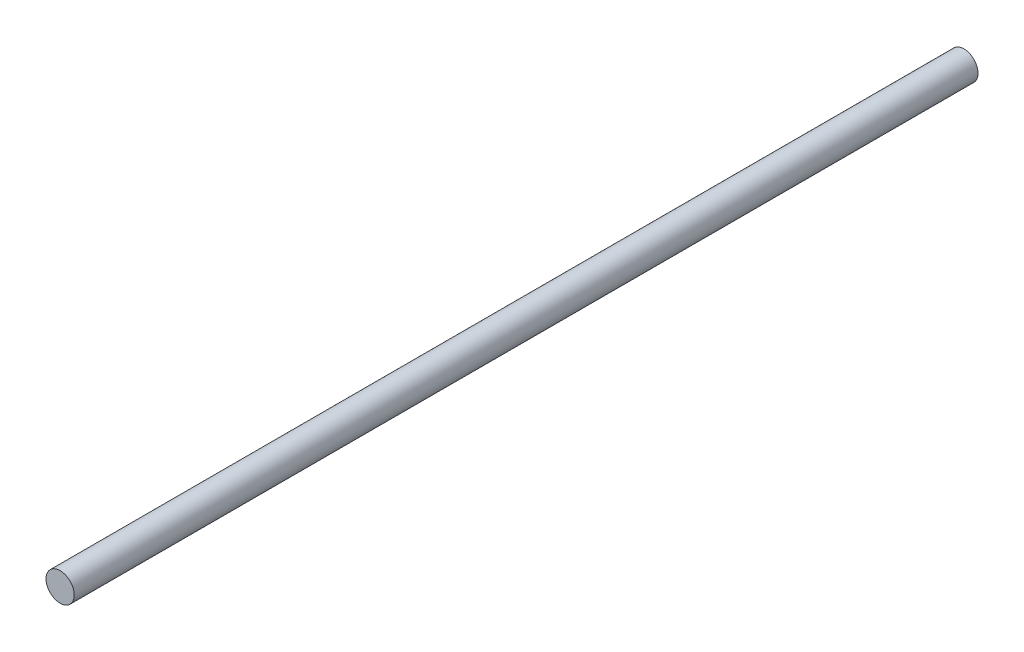
ISO-10303-21;
HEADER;
FILE_DESCRIPTION(('STEP AP214'),'2;1');
FILE_NAME('part.step','',(''),(''),'','','');
FILE_SCHEMA(('AUTOMOTIVE_DESIGN { 1 0 10303 214 1 1 1 1 }'));
ENDSEC;
DATA;
#1=APPLICATION_CONTEXT('core data for automotive mechanical design processes');
#2=APPLICATION_PROTOCOL_DEFINITION('international standard','automotive_design',2000,#1);
#3=PRODUCT_CONTEXT('',#1,'mechanical');
#4=PRODUCT('Part','Part','',(#3));
#5=PRODUCT_RELATED_PRODUCT_CATEGORY('part','',(#4));
#6=PRODUCT_DEFINITION_FORMATION('','',#4);
#7=PRODUCT_DEFINITION_CONTEXT('part definition',#1,'design');
#8=PRODUCT_DEFINITION('design','',#6,#7);
#9=PRODUCT_DEFINITION_SHAPE('','',#8);
#10=(LENGTH_UNIT() NAMED_UNIT(*) SI_UNIT(.MILLI.,.METRE.));
#11=(NAMED_UNIT(*) PLANE_ANGLE_UNIT() SI_UNIT($,.RADIAN.));
#12=(NAMED_UNIT(*) SI_UNIT($,.STERADIAN.) SOLID_ANGLE_UNIT());
#13=UNCERTAINTY_MEASURE_WITH_UNIT(LENGTH_MEASURE(1.E-05),#10,'distance_accuracy_value','');
#14=(GEOMETRIC_REPRESENTATION_CONTEXT(3) GLOBAL_UNCERTAINTY_ASSIGNED_CONTEXT((#13)) GLOBAL_UNIT_ASSIGNED_CONTEXT((#10,
#11,#12)) REPRESENTATION_CONTEXT('',''));
#15=CARTESIAN_POINT('',(0.,0.,0.));
#16=DIRECTION('',(0.,0.,1.));
#17=DIRECTION('',(1.,0.,0.));
#18=AXIS2_PLACEMENT_3D('',#15,#16,#17);
#19=CARTESIAN_POINT('',(0.,0.,160.));
#20=DIRECTION('',(0.,0.,1.));
#21=DIRECTION('',(1.,0.,0.));
#22=AXIS2_PLACEMENT_3D('',#19,#20,#21);
#23=PLANE('',#22);
#24=CARTESIAN_POINT('',(0.,0.,160.));
#25=DIRECTION('',(0.,0.,-1.));
#26=DIRECTION('',(-1.,0.,0.));
#27=AXIS2_PLACEMENT_3D('',#24,#25,#26);
#28=CIRCLE('',#27,2.5);
#29=CARTESIAN_POINT('',(-2.5,0.,160.));
#30=VERTEX_POINT('',#29);
#31=EDGE_CURVE('E18',#30,#30,#28,.T.);
#32=ORIENTED_EDGE('',*,*,#31,.F.);
#33=EDGE_LOOP('',(#32));
#34=FACE_BOUND('',#33,.T.);
#35=ADVANCED_FACE('F15',(#34),#23,.T.);
#36=CARTESIAN_POINT('',(0.,0.,0.));
#37=DIRECTION('',(0.,0.,1.));
#38=DIRECTION('',(1.,0.,0.));
#39=AXIS2_PLACEMENT_3D('',#36,#37,#38);
#40=PLANE('',#39);
#41=CARTESIAN_POINT('',(0.,0.,0.));
#42=DIRECTION('',(0.,0.,-1.));
#43=DIRECTION('',(-1.,0.,0.));
#44=AXIS2_PLACEMENT_3D('',#41,#42,#43);
#45=CIRCLE('',#44,2.5);
#46=CARTESIAN_POINT('',(-2.5,0.,0.));
#47=VERTEX_POINT('',#46);
#48=EDGE_CURVE('E10',#47,#47,#45,.F.);
#49=ORIENTED_EDGE('',*,*,#48,.F.);
#50=EDGE_LOOP('',(#49));
#51=FACE_BOUND('',#50,.T.);
#52=ADVANCED_FACE('F30',(#51),#40,.F.);
#53=CARTESIAN_POINT('',(0.,0.,160.));
#54=DIRECTION('',(0.,0.,-1.));
#55=DIRECTION('',(-1.,0.,0.));
#56=AXIS2_PLACEMENT_3D('',#53,#54,#55);
#57=CYLINDRICAL_SURFACE('',#56,2.5);
#58=ORIENTED_EDGE('',*,*,#48,.T.);
#59=EDGE_LOOP('',(#58));
#60=FACE_BOUND('',#59,.T.);
#61=ORIENTED_EDGE('',*,*,#31,.T.);
#62=EDGE_LOOP('',(#61));
#63=FACE_BOUND('',#62,.T.);
#64=ADVANCED_FACE('F27',(#60,#63),#57,.T.);
#65=CLOSED_SHELL('',(#35,#52,#64));
#66=MANIFOLD_SOLID_BREP('B1',#65);
#67=ADVANCED_BREP_SHAPE_REPRESENTATION('',(#18,#66),#14);
#68=SHAPE_DEFINITION_REPRESENTATION(#9,#67);
ENDSEC;
END-ISO-10303-21;
